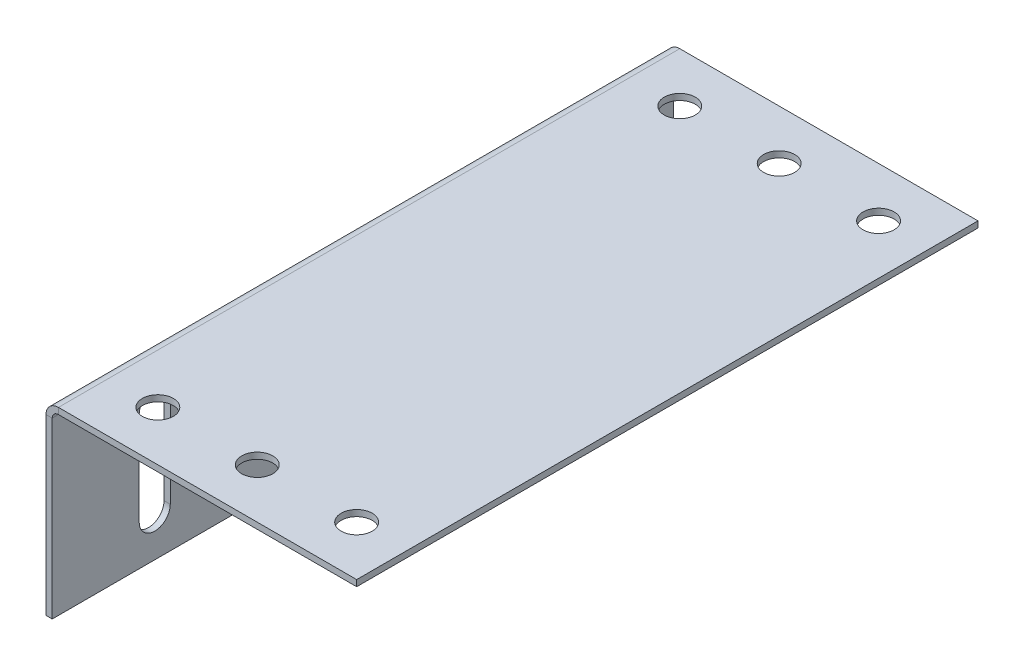
ISO-10303-21;
HEADER;
FILE_DESCRIPTION(('STEP AP214'),'2;1');
FILE_NAME('part.step','',(''),(''),'','','');
FILE_SCHEMA(('AUTOMOTIVE_DESIGN { 1 0 10303 214 1 1 1 1 }'));
ENDSEC;
DATA;
#1=APPLICATION_CONTEXT('core data for automotive mechanical design processes');
#2=APPLICATION_PROTOCOL_DEFINITION('international standard','automotive_design',2000,#1);
#3=PRODUCT_CONTEXT('',#1,'mechanical');
#4=PRODUCT('Part','Part','',(#3));
#5=PRODUCT_RELATED_PRODUCT_CATEGORY('part','',(#4));
#6=PRODUCT_DEFINITION_FORMATION('','',#4);
#7=PRODUCT_DEFINITION_CONTEXT('part definition',#1,'design');
#8=PRODUCT_DEFINITION('design','',#6,#7);
#9=PRODUCT_DEFINITION_SHAPE('','',#8);
#10=(LENGTH_UNIT() NAMED_UNIT(*) SI_UNIT(.MILLI.,.METRE.));
#11=(NAMED_UNIT(*) PLANE_ANGLE_UNIT() SI_UNIT($,.RADIAN.));
#12=(NAMED_UNIT(*) SI_UNIT($,.STERADIAN.) SOLID_ANGLE_UNIT());
#13=UNCERTAINTY_MEASURE_WITH_UNIT(LENGTH_MEASURE(1.E-05),#10,'distance_accuracy_value','');
#14=(GEOMETRIC_REPRESENTATION_CONTEXT(3) GLOBAL_UNCERTAINTY_ASSIGNED_CONTEXT((#13)) GLOBAL_UNIT_ASSIGNED_CONTEXT((#10,
#11,#12)) REPRESENTATION_CONTEXT('',''));
#15=CARTESIAN_POINT('',(0.,0.,0.));
#16=DIRECTION('',(0.,0.,1.));
#17=DIRECTION('',(1.,0.,0.));
#18=AXIS2_PLACEMENT_3D('',#15,#16,#17);
#19=CARTESIAN_POINT('',(0.,0.,100.));
#20=DIRECTION('',(-1.,0.,0.));
#21=DIRECTION('',(0.,0.,1.));
#22=AXIS2_PLACEMENT_3D('',#19,#20,#21);
#23=PLANE('',#22);
#24=DIRECTION('',(0.,1.,0.));
#25=VECTOR('',#24,1.);
#26=CARTESIAN_POINT('',(0.,0.,0.));
#27=LINE('',#26,#25);
#28=CARTESIAN_POINT('',(0.,0.,0.));
#29=VERTEX_POINT('',#28);
#30=CARTESIAN_POINT('',(0.,28.,0.));
#31=VERTEX_POINT('',#30);
#32=EDGE_CURVE('E404',#29,#31,#27,.T.);
#33=ORIENTED_EDGE('',*,*,#32,.F.);
#34=DIRECTION('',(0.,0.,-1.));
#35=VECTOR('',#34,1.);
#36=CARTESIAN_POINT('',(0.,0.,100.));
#37=LINE('',#36,#35);
#38=CARTESIAN_POINT('',(0.,0.,100.));
#39=VERTEX_POINT('',#38);
#40=EDGE_CURVE('E422',#39,#29,#37,.T.);
#41=ORIENTED_EDGE('',*,*,#40,.F.);
#42=DIRECTION('',(0.,1.,0.));
#43=VECTOR('',#42,1.);
#44=CARTESIAN_POINT('',(0.,0.,100.));
#45=LINE('',#44,#43);
#46=CARTESIAN_POINT('',(0.,28.,100.));
#47=VERTEX_POINT('',#46);
#48=EDGE_CURVE('E380',#39,#47,#45,.T.);
#49=ORIENTED_EDGE('',*,*,#48,.T.);
#50=DIRECTION('',(0.,0.,-1.));
#51=VECTOR('',#50,1.);
#52=CARTESIAN_POINT('',(0.,28.,100.));
#53=LINE('',#52,#51);
#54=EDGE_CURVE('E424',#47,#31,#53,.T.);
#55=ORIENTED_EDGE('',*,*,#54,.T.);
#56=EDGE_LOOP('',(#33,#41,#49,#55));
#57=FACE_BOUND('',#56,.T.);
#58=DIRECTION('',(0.,-1.,0.));
#59=VECTOR('',#58,1.);
#60=CARTESIAN_POINT('',(0.,0.,39.));
#61=LINE('',#60,#59);
#62=CARTESIAN_POINT('',(0.,21.4999999999999,39.));
#63=VERTEX_POINT('',#62);
#64=CARTESIAN_POINT('',(0.,6.49999999999986,39.));
#65=VERTEX_POINT('',#64);
#66=EDGE_CURVE('E281',#63,#65,#61,.T.);
#67=ORIENTED_EDGE('',*,*,#66,.T.);
#68=CARTESIAN_POINT('',(0.,6.49999999999986,36.5));
#69=DIRECTION('',(-1.,0.,0.));
#70=DIRECTION('',(0.,0.,1.));
#71=AXIS2_PLACEMENT_3D('',#68,#69,#70);
#72=CIRCLE('',#71,2.5);
#73=CARTESIAN_POINT('',(0.,6.49999999999986,34.));
#74=VERTEX_POINT('',#73);
#75=EDGE_CURVE('E278',#65,#74,#72,.F.);
#76=ORIENTED_EDGE('',*,*,#75,.T.);
#77=DIRECTION('',(0.,-1.,0.));
#78=VECTOR('',#77,1.);
#79=CARTESIAN_POINT('',(0.,0.,34.));
#80=LINE('',#79,#78);
#81=CARTESIAN_POINT('',(0.,21.4999999999999,34.));
#82=VERTEX_POINT('',#81);
#83=EDGE_CURVE('E287',#82,#74,#80,.T.);
#84=ORIENTED_EDGE('',*,*,#83,.F.);
#85=CARTESIAN_POINT('',(0.,21.4999999999999,36.5));
#86=DIRECTION('',(-1.,0.,0.));
#87=DIRECTION('',(0.,0.,1.));
#88=AXIS2_PLACEMENT_3D('',#85,#86,#87);
#89=CIRCLE('',#88,2.5);
#90=EDGE_CURVE('E284',#82,#63,#89,.F.);
#91=ORIENTED_EDGE('',*,*,#90,.T.);
#92=EDGE_LOOP('',(#67,#76,#84,#91));
#93=FACE_BOUND('',#92,.T.);
#94=CARTESIAN_POINT('',(0.,21.5,83.5));
#95=DIRECTION('',(-1.,0.,0.));
#96=DIRECTION('',(0.,0.,1.));
#97=AXIS2_PLACEMENT_3D('',#94,#95,#96);
#98=CIRCLE('',#97,2.5);
#99=CARTESIAN_POINT('',(0.,21.5,86.));
#100=VERTEX_POINT('',#99);
#101=CARTESIAN_POINT('',(0.,21.5,81.));
#102=VERTEX_POINT('',#101);
#103=EDGE_CURVE('E312',#100,#102,#98,.T.);
#104=ORIENTED_EDGE('',*,*,#103,.F.);
#105=DIRECTION('',(0.,-1.,0.));
#106=VECTOR('',#105,1.);
#107=CARTESIAN_POINT('',(0.,0.,86.));
#108=LINE('',#107,#106);
#109=CARTESIAN_POINT('',(0.,6.49999999999999,86.));
#110=VERTEX_POINT('',#109);
#111=EDGE_CURVE('E309',#100,#110,#108,.T.);
#112=ORIENTED_EDGE('',*,*,#111,.T.);
#113=CARTESIAN_POINT('',(0.,6.49999999999999,83.5));
#114=DIRECTION('',(-1.,0.,0.));
#115=DIRECTION('',(0.,0.,1.));
#116=AXIS2_PLACEMENT_3D('',#113,#114,#115);
#117=CIRCLE('',#116,2.5);
#118=CARTESIAN_POINT('',(0.,6.49999999999999,81.));
#119=VERTEX_POINT('',#118);
#120=EDGE_CURVE('E318',#119,#110,#117,.T.);
#121=ORIENTED_EDGE('',*,*,#120,.F.);
#122=DIRECTION('',(0.,-1.,0.));
#123=VECTOR('',#122,1.);
#124=CARTESIAN_POINT('',(0.,0.,81.));
#125=LINE('',#124,#123);
#126=EDGE_CURVE('E315',#102,#119,#125,.T.);
#127=ORIENTED_EDGE('',*,*,#126,.F.);
#128=EDGE_LOOP('',(#104,#112,#121,#127));
#129=FACE_BOUND('',#128,.T.);
#130=CARTESIAN_POINT('',(0.,21.4999999999999,63.5));
#131=DIRECTION('',(-1.,0.,0.));
#132=DIRECTION('',(0.,0.,1.));
#133=AXIS2_PLACEMENT_3D('',#130,#131,#132);
#134=CIRCLE('',#133,2.5);
#135=CARTESIAN_POINT('',(0.,21.4999999999999,66.));
#136=VERTEX_POINT('',#135);
#137=CARTESIAN_POINT('',(0.,21.4999999999998,61.));
#138=VERTEX_POINT('',#137);
#139=EDGE_CURVE('E248',#136,#138,#134,.T.);
#140=ORIENTED_EDGE('',*,*,#139,.F.);
#141=DIRECTION('',(0.,-1.,0.));
#142=VECTOR('',#141,1.);
#143=CARTESIAN_POINT('',(0.,0.,66.));
#144=LINE('',#143,#142);
#145=CARTESIAN_POINT('',(0.,6.49999999999985,66.));
#146=VERTEX_POINT('',#145);
#147=EDGE_CURVE('E63',#136,#146,#144,.T.);
#148=ORIENTED_EDGE('',*,*,#147,.T.);
#149=CARTESIAN_POINT('',(0.,6.49999999999985,63.5));
#150=DIRECTION('',(-1.,0.,0.));
#151=DIRECTION('',(0.,0.,1.));
#152=AXIS2_PLACEMENT_3D('',#149,#150,#151);
#153=CIRCLE('',#152,2.5);
#154=CARTESIAN_POINT('',(0.,6.49999999999985,61.));
#155=VERTEX_POINT('',#154);
#156=EDGE_CURVE('E254',#155,#146,#153,.T.);
#157=ORIENTED_EDGE('',*,*,#156,.F.);
#158=DIRECTION('',(0.,-1.,0.));
#159=VECTOR('',#158,1.);
#160=CARTESIAN_POINT('',(0.,0.,61.));
#161=LINE('',#160,#159);
#162=EDGE_CURVE('E251',#138,#155,#161,.T.);
#163=ORIENTED_EDGE('',*,*,#162,.F.);
#164=EDGE_LOOP('',(#140,#148,#157,#163));
#165=FACE_BOUND('',#164,.T.);
#166=DIRECTION('',(0.,-1.,0.));
#167=VECTOR('',#166,1.);
#168=CARTESIAN_POINT('',(0.,0.,14.));
#169=LINE('',#168,#167);
#170=CARTESIAN_POINT('',(0.,21.5,14.));
#171=VERTEX_POINT('',#170);
#172=CARTESIAN_POINT('',(0.,6.5,14.));
#173=VERTEX_POINT('',#172);
#174=EDGE_CURVE('E223',#171,#173,#169,.T.);
#175=ORIENTED_EDGE('',*,*,#174,.F.);
#176=CARTESIAN_POINT('',(0.,21.5,16.5));
#177=DIRECTION('',(-1.,0.,0.));
#178=DIRECTION('',(0.,0.,1.));
#179=AXIS2_PLACEMENT_3D('',#176,#177,#178);
#180=CIRCLE('',#179,2.5);
#181=CARTESIAN_POINT('',(0.,21.5,19.));
#182=VERTEX_POINT('',#181);
#183=EDGE_CURVE('E55',#171,#182,#180,.F.);
#184=ORIENTED_EDGE('',*,*,#183,.T.);
#185=DIRECTION('',(0.,-1.,0.));
#186=VECTOR('',#185,1.);
#187=CARTESIAN_POINT('',(0.,0.,19.));
#188=LINE('',#187,#186);
#189=CARTESIAN_POINT('',(0.,6.5,19.));
#190=VERTEX_POINT('',#189);
#191=EDGE_CURVE('E208',#182,#190,#188,.T.);
#192=ORIENTED_EDGE('',*,*,#191,.T.);
#193=CARTESIAN_POINT('',(0.,6.5,16.5));
#194=DIRECTION('',(-1.,0.,0.));
#195=DIRECTION('',(0.,0.,1.));
#196=AXIS2_PLACEMENT_3D('',#193,#194,#195);
#197=CIRCLE('',#196,2.5);
#198=EDGE_CURVE('E230',#190,#173,#197,.F.);
#199=ORIENTED_EDGE('',*,*,#198,.T.);
#200=EDGE_LOOP('',(#175,#184,#192,#199));
#201=FACE_BOUND('',#200,.T.);
#202=ADVANCED_FACE('F40',(#57,#93,#129,#165,#201),#23,.T.);
#203=CARTESIAN_POINT('',(1.,0.,100.));
#204=DIRECTION('',(-1.,0.,0.));
#205=DIRECTION('',(0.,0.,1.));
#206=AXIS2_PLACEMENT_3D('',#203,#204,#205);
#207=PLANE('',#206);
#208=DIRECTION('',(0.,1.,0.));
#209=VECTOR('',#208,1.);
#210=CARTESIAN_POINT('',(1.,0.,66.));
#211=LINE('',#210,#209);
#212=CARTESIAN_POINT('',(1.,6.49999999999985,66.));
#213=VERTEX_POINT('',#212);
#214=CARTESIAN_POINT('',(1.,21.4999999999999,66.));
#215=VERTEX_POINT('',#214);
#216=EDGE_CURVE('E244',#213,#215,#211,.T.);
#217=ORIENTED_EDGE('',*,*,#216,.T.);
#218=CARTESIAN_POINT('',(1.,21.4999999999999,63.5));
#219=DIRECTION('',(-1.,0.,0.));
#220=DIRECTION('',(0.,0.,1.));
#221=AXIS2_PLACEMENT_3D('',#218,#219,#220);
#222=CIRCLE('',#221,2.5);
#223=CARTESIAN_POINT('',(1.,21.4999999999998,61.));
#224=VERTEX_POINT('',#223);
#225=EDGE_CURVE('E260',#224,#215,#222,.F.);
#226=ORIENTED_EDGE('',*,*,#225,.F.);
#227=DIRECTION('',(0.,1.,0.));
#228=VECTOR('',#227,1.);
#229=CARTESIAN_POINT('',(1.,0.,61.));
#230=LINE('',#229,#228);
#231=CARTESIAN_POINT('',(1.,6.49999999999985,61.));
#232=VERTEX_POINT('',#231);
#233=EDGE_CURVE('E239',#232,#224,#230,.T.);
#234=ORIENTED_EDGE('',*,*,#233,.F.);
#235=CARTESIAN_POINT('',(1.,6.49999999999985,63.5));
#236=DIRECTION('',(-1.,0.,0.));
#237=DIRECTION('',(0.,0.,1.));
#238=AXIS2_PLACEMENT_3D('',#235,#236,#237);
#239=CIRCLE('',#238,2.5);
#240=EDGE_CURVE('E241',#213,#232,#239,.F.);
#241=ORIENTED_EDGE('',*,*,#240,.F.);
#242=EDGE_LOOP('',(#217,#226,#234,#241));
#243=FACE_BOUND('',#242,.T.);
#244=CARTESIAN_POINT('',(1.,6.49999999999986,36.5));
#245=DIRECTION('',(-1.,0.,0.));
#246=DIRECTION('',(0.,0.,1.));
#247=AXIS2_PLACEMENT_3D('',#244,#245,#246);
#248=CIRCLE('',#247,2.5);
#249=CARTESIAN_POINT('',(1.,6.49999999999986,34.));
#250=VERTEX_POINT('',#249);
#251=CARTESIAN_POINT('',(1.,6.49999999999986,39.));
#252=VERTEX_POINT('',#251);
#253=EDGE_CURVE('E275',#250,#252,#248,.T.);
#254=ORIENTED_EDGE('',*,*,#253,.T.);
#255=DIRECTION('',(0.,1.,0.));
#256=VECTOR('',#255,1.);
#257=CARTESIAN_POINT('',(1.,0.,39.));
#258=LINE('',#257,#256);
#259=CARTESIAN_POINT('',(1.,21.4999999999999,39.));
#260=VERTEX_POINT('',#259);
#261=EDGE_CURVE('E293',#252,#260,#258,.T.);
#262=ORIENTED_EDGE('',*,*,#261,.T.);
#263=CARTESIAN_POINT('',(1.,21.4999999999999,36.5));
#264=DIRECTION('',(-1.,0.,0.));
#265=DIRECTION('',(0.,0.,1.));
#266=AXIS2_PLACEMENT_3D('',#263,#264,#265);
#267=CIRCLE('',#266,2.5);
#268=CARTESIAN_POINT('',(1.,21.4999999999999,34.));
#269=VERTEX_POINT('',#268);
#270=EDGE_CURVE('E269',#260,#269,#267,.T.);
#271=ORIENTED_EDGE('',*,*,#270,.T.);
#272=DIRECTION('',(0.,1.,0.));
#273=VECTOR('',#272,1.);
#274=CARTESIAN_POINT('',(1.,0.,34.));
#275=LINE('',#274,#273);
#276=EDGE_CURVE('E272',#250,#269,#275,.T.);
#277=ORIENTED_EDGE('',*,*,#276,.F.);
#278=EDGE_LOOP('',(#254,#262,#271,#277));
#279=FACE_BOUND('',#278,.T.);
#280=DIRECTION('',(0.,1.,0.));
#281=VECTOR('',#280,1.);
#282=CARTESIAN_POINT('',(1.,0.,0.));
#283=LINE('',#282,#281);
#284=CARTESIAN_POINT('',(1.,0.,0.));
#285=VERTEX_POINT('',#284);
#286=CARTESIAN_POINT('',(1.,28.,0.));
#287=VERTEX_POINT('',#286);
#288=EDGE_CURVE('E410',#285,#287,#283,.T.);
#289=ORIENTED_EDGE('',*,*,#288,.T.);
#290=DIRECTION('',(0.,0.,-1.));
#291=VECTOR('',#290,1.);
#292=CARTESIAN_POINT('',(1.,28.,100.));
#293=LINE('',#292,#291);
#294=CARTESIAN_POINT('',(1.,28.,100.));
#295=VERTEX_POINT('',#294);
#296=EDGE_CURVE('E417',#295,#287,#293,.T.);
#297=ORIENTED_EDGE('',*,*,#296,.F.);
#298=DIRECTION('',(0.,1.,0.));
#299=VECTOR('',#298,1.);
#300=CARTESIAN_POINT('',(1.,0.,100.));
#301=LINE('',#300,#299);
#302=CARTESIAN_POINT('',(1.,0.,100.));
#303=VERTEX_POINT('',#302);
#304=EDGE_CURVE('E386',#303,#295,#301,.T.);
#305=ORIENTED_EDGE('',*,*,#304,.F.);
#306=DIRECTION('',(0.,0.,-1.));
#307=VECTOR('',#306,1.);
#308=CARTESIAN_POINT('',(1.,0.,100.));
#309=LINE('',#308,#307);
#310=EDGE_CURVE('E420',#303,#285,#309,.T.);
#311=ORIENTED_EDGE('',*,*,#310,.T.);
#312=EDGE_LOOP('',(#289,#297,#305,#311));
#313=FACE_BOUND('',#312,.T.);
#314=DIRECTION('',(0.,1.,0.));
#315=VECTOR('',#314,1.);
#316=CARTESIAN_POINT('',(1.,0.,86.));
#317=LINE('',#316,#315);
#318=CARTESIAN_POINT('',(1.,6.49999999999999,86.));
#319=VERTEX_POINT('',#318);
#320=CARTESIAN_POINT('',(1.,21.5,86.));
#321=VERTEX_POINT('',#320);
#322=EDGE_CURVE('E306',#319,#321,#317,.T.);
#323=ORIENTED_EDGE('',*,*,#322,.T.);
#324=CARTESIAN_POINT('',(1.,21.5,83.5));
#325=DIRECTION('',(-1.,0.,0.));
#326=DIRECTION('',(0.,0.,1.));
#327=AXIS2_PLACEMENT_3D('',#324,#325,#326);
#328=CIRCLE('',#327,2.5);
#329=CARTESIAN_POINT('',(1.,21.5,81.));
#330=VERTEX_POINT('',#329);
#331=EDGE_CURVE('E273',#330,#321,#328,.F.);
#332=ORIENTED_EDGE('',*,*,#331,.F.);
#333=DIRECTION('',(0.,1.,0.));
#334=VECTOR('',#333,1.);
#335=CARTESIAN_POINT('',(1.,0.,81.));
#336=LINE('',#335,#334);
#337=CARTESIAN_POINT('',(1.,6.49999999999999,81.));
#338=VERTEX_POINT('',#337);
#339=EDGE_CURVE('E268',#338,#330,#336,.T.);
#340=ORIENTED_EDGE('',*,*,#339,.F.);
#341=CARTESIAN_POINT('',(1.,6.49999999999999,83.5));
#342=DIRECTION('',(-1.,0.,0.));
#343=DIRECTION('',(0.,0.,1.));
#344=AXIS2_PLACEMENT_3D('',#341,#342,#343);
#345=CIRCLE('',#344,2.5);
#346=EDGE_CURVE('E303',#319,#338,#345,.F.);
#347=ORIENTED_EDGE('',*,*,#346,.F.);
#348=EDGE_LOOP('',(#323,#332,#340,#347));
#349=FACE_BOUND('',#348,.T.);
#350=CARTESIAN_POINT('',(1.,21.5,16.5));
#351=DIRECTION('',(-1.,0.,0.));
#352=DIRECTION('',(0.,0.,1.));
#353=AXIS2_PLACEMENT_3D('',#350,#351,#352);
#354=CIRCLE('',#353,2.5);
#355=CARTESIAN_POINT('',(1.,21.5,19.));
#356=VERTEX_POINT('',#355);
#357=CARTESIAN_POINT('',(1.,21.5,14.));
#358=VERTEX_POINT('',#357);
#359=EDGE_CURVE('E202',#356,#358,#354,.T.);
#360=ORIENTED_EDGE('',*,*,#359,.T.);
#361=DIRECTION('',(0.,1.,0.));
#362=VECTOR('',#361,1.);
#363=CARTESIAN_POINT('',(1.,0.,14.));
#364=LINE('',#363,#362);
#365=CARTESIAN_POINT('',(1.,6.5,14.));
#366=VERTEX_POINT('',#365);
#367=EDGE_CURVE('E212',#366,#358,#364,.T.);
#368=ORIENTED_EDGE('',*,*,#367,.F.);
#369=CARTESIAN_POINT('',(1.,6.5,16.5));
#370=DIRECTION('',(-1.,0.,0.));
#371=DIRECTION('',(0.,0.,1.));
#372=AXIS2_PLACEMENT_3D('',#369,#370,#371);
#373=CIRCLE('',#372,2.5);
#374=CARTESIAN_POINT('',(1.,6.5,19.));
#375=VERTEX_POINT('',#374);
#376=EDGE_CURVE('E225',#366,#375,#373,.T.);
#377=ORIENTED_EDGE('',*,*,#376,.T.);
#378=DIRECTION('',(0.,1.,0.));
#379=VECTOR('',#378,1.);
#380=CARTESIAN_POINT('',(1.,0.,19.));
#381=LINE('',#380,#379);
#382=EDGE_CURVE('E221',#375,#356,#381,.T.);
#383=ORIENTED_EDGE('',*,*,#382,.T.);
#384=EDGE_LOOP('',(#360,#368,#377,#383));
#385=FACE_BOUND('',#384,.T.);
#386=ADVANCED_FACE('F219',(#243,#279,#313,#349,#385),#207,.F.);
#387=CARTESIAN_POINT('',(2.,30.,100.));
#388=DIRECTION('',(0.,0.,1.));
#389=DIRECTION('',(1.,0.,0.));
#390=AXIS2_PLACEMENT_3D('',#387,#388,#389);
#391=PLANE('',#390);
#392=DIRECTION('',(0.,-1.,0.));
#393=VECTOR('',#392,1.);
#394=CARTESIAN_POINT('',(2.,30.,100.));
#395=LINE('',#394,#393);
#396=CARTESIAN_POINT('',(2.,30.,100.));
#397=VERTEX_POINT('',#396);
#398=CARTESIAN_POINT('',(2.,29.,100.));
#399=VERTEX_POINT('',#398);
#400=EDGE_CURVE('E11',#397,#399,#395,.T.);
#401=ORIENTED_EDGE('',*,*,#400,.F.);
#402=CARTESIAN_POINT('',(2.,28.,100.));
#403=DIRECTION('',(0.,0.,1.));
#404=DIRECTION('',(1.,0.,0.));
#405=AXIS2_PLACEMENT_3D('',#402,#403,#404);
#406=CIRCLE('',#405,2.);
#407=EDGE_CURVE('E377',#47,#397,#406,.F.);
#408=ORIENTED_EDGE('',*,*,#407,.F.);
#409=DIRECTION('',(-1.,0.,0.));
#410=VECTOR('',#409,1.);
#411=CARTESIAN_POINT('',(1.,28.,100.));
#412=LINE('',#411,#410);
#413=EDGE_CURVE('E48',#295,#47,#412,.T.);
#414=ORIENTED_EDGE('',*,*,#413,.F.);
#415=CARTESIAN_POINT('',(2.,28.,100.));
#416=DIRECTION('',(0.,0.,1.));
#417=DIRECTION('',(1.,0.,0.));
#418=AXIS2_PLACEMENT_3D('',#415,#416,#417);
#419=CIRCLE('',#418,1.);
#420=EDGE_CURVE('E389',#295,#399,#419,.F.);
#421=ORIENTED_EDGE('',*,*,#420,.T.);
#422=EDGE_LOOP('',(#401,#408,#414,#421));
#423=FACE_BOUND('',#422,.T.);
#424=ADVANCED_FACE('F42',(#423),#391,.T.);
#425=CARTESIAN_POINT('',(1.,28.,100.));
#426=DIRECTION('',(0.,0.,1.));
#427=DIRECTION('',(1.,0.,0.));
#428=AXIS2_PLACEMENT_3D('',#425,#426,#427);
#429=PLANE('',#428);
#430=DIRECTION('',(1.,0.,0.));
#431=VECTOR('',#430,1.);
#432=CARTESIAN_POINT('',(0.,30.,100.));
#433=LINE('',#432,#431);
#434=CARTESIAN_POINT('',(50.,30.,100.));
#435=VERTEX_POINT('',#434);
#436=EDGE_CURVE('E374',#397,#435,#433,.T.);
#437=ORIENTED_EDGE('',*,*,#436,.F.);
#438=ORIENTED_EDGE('',*,*,#400,.T.);
#439=DIRECTION('',(1.,0.,0.));
#440=VECTOR('',#439,1.);
#441=CARTESIAN_POINT('',(0.,29.,100.));
#442=LINE('',#441,#440);
#443=CARTESIAN_POINT('',(50.,29.,100.));
#444=VERTEX_POINT('',#443);
#445=EDGE_CURVE('E368',#399,#444,#442,.T.);
#446=ORIENTED_EDGE('',*,*,#445,.T.);
#447=DIRECTION('',(0.,-1.,0.));
#448=VECTOR('',#447,1.);
#449=CARTESIAN_POINT('',(50.,30.,100.));
#450=LINE('',#449,#448);
#451=EDGE_CURVE('E370',#435,#444,#450,.T.);
#452=ORIENTED_EDGE('',*,*,#451,.F.);
#453=EDGE_LOOP('',(#437,#438,#446,#452));
#454=FACE_BOUND('',#453,.T.);
#455=ADVANCED_FACE('F472',(#454),#429,.T.);
#456=CARTESIAN_POINT('',(0.,28.,0.));
#457=DIRECTION('',(0.,0.,-1.));
#458=DIRECTION('',(-1.,0.,0.));
#459=AXIS2_PLACEMENT_3D('',#456,#457,#458);
#460=PLANE('',#459);
#461=DIRECTION('',(1.,0.,0.));
#462=VECTOR('',#461,1.);
#463=CARTESIAN_POINT('',(0.,28.,0.));
#464=LINE('',#463,#462);
#465=EDGE_CURVE('E436',#31,#287,#464,.T.);
#466=ORIENTED_EDGE('',*,*,#465,.F.);
#467=CARTESIAN_POINT('',(2.,28.,0.));
#468=DIRECTION('',(0.,0.,1.));
#469=DIRECTION('',(1.,0.,0.));
#470=AXIS2_PLACEMENT_3D('',#467,#468,#469);
#471=CIRCLE('',#470,2.);
#472=CARTESIAN_POINT('',(2.,30.,0.));
#473=VERTEX_POINT('',#472);
#474=EDGE_CURVE('E401',#31,#473,#471,.F.);
#475=ORIENTED_EDGE('',*,*,#474,.T.);
#476=DIRECTION('',(0.,1.,0.));
#477=VECTOR('',#476,1.);
#478=CARTESIAN_POINT('',(2.,29.,0.));
#479=LINE('',#478,#477);
#480=CARTESIAN_POINT('',(2.,29.,0.));
#481=VERTEX_POINT('',#480);
#482=EDGE_CURVE('E434',#481,#473,#479,.T.);
#483=ORIENTED_EDGE('',*,*,#482,.F.);
#484=CARTESIAN_POINT('',(2.,28.,0.));
#485=DIRECTION('',(0.,0.,1.));
#486=DIRECTION('',(1.,0.,0.));
#487=AXIS2_PLACEMENT_3D('',#484,#485,#486);
#488=CIRCLE('',#487,1.);
#489=EDGE_CURVE('E371',#287,#481,#488,.F.);
#490=ORIENTED_EDGE('',*,*,#489,.F.);
#491=EDGE_LOOP('',(#466,#475,#483,#490));
#492=FACE_BOUND('',#491,.T.);
#493=ADVANCED_FACE('F479',(#492),#460,.T.);
#494=CARTESIAN_POINT('',(2.,29.,0.));
#495=DIRECTION('',(0.,0.,-1.));
#496=DIRECTION('',(-1.,0.,0.));
#497=AXIS2_PLACEMENT_3D('',#494,#495,#496);
#498=PLANE('',#497);
#499=ORIENTED_EDGE('',*,*,#32,.T.);
#500=ORIENTED_EDGE('',*,*,#465,.T.);
#501=ORIENTED_EDGE('',*,*,#288,.F.);
#502=DIRECTION('',(-1.,0.,0.));
#503=VECTOR('',#502,1.);
#504=CARTESIAN_POINT('',(1.,0.,0.));
#505=LINE('',#504,#503);
#506=EDGE_CURVE('E407',#285,#29,#505,.T.);
#507=ORIENTED_EDGE('',*,*,#506,.T.);
#508=EDGE_LOOP('',(#499,#500,#501,#507));
#509=FACE_BOUND('',#508,.T.);
#510=ADVANCED_FACE('F481',(#509),#498,.T.);
#511=CARTESIAN_POINT('',(0.,29.,100.));
#512=DIRECTION('',(0.,1.,0.));
#513=DIRECTION('',(0.,0.,1.));
#514=AXIS2_PLACEMENT_3D('',#511,#512,#513);
#515=PLANE('',#514);
#516=CARTESIAN_POINT('',(26.,29.,8.));
#517=DIRECTION('',(0.,1.,0.));
#518=DIRECTION('',(0.,0.,1.));
#519=AXIS2_PLACEMENT_3D('',#516,#517,#518);
#520=CIRCLE('',#519,2.5);
#521=CARTESIAN_POINT('',(26.,29.,10.5));
#522=VERTEX_POINT('',#521);
#523=EDGE_CURVE('E342',#522,#522,#520,.F.);
#524=ORIENTED_EDGE('',*,*,#523,.F.);
#525=EDGE_LOOP('',(#524));
#526=FACE_BOUND('',#525,.T.);
#527=CARTESIAN_POINT('',(10.,29.,92.));
#528=DIRECTION('',(0.,1.,0.));
#529=DIRECTION('',(0.,0.,1.));
#530=AXIS2_PLACEMENT_3D('',#527,#528,#529);
#531=CIRCLE('',#530,2.5);
#532=CARTESIAN_POINT('',(10.,29.,94.5));
#533=VERTEX_POINT('',#532);
#534=EDGE_CURVE('E341',#533,#533,#531,.F.);
#535=ORIENTED_EDGE('',*,*,#534,.F.);
#536=EDGE_LOOP('',(#535));
#537=FACE_BOUND('',#536,.T.);
#538=CARTESIAN_POINT('',(42.,29.,92.));
#539=DIRECTION('',(0.,1.,0.));
#540=DIRECTION('',(0.,0.,1.));
#541=AXIS2_PLACEMENT_3D('',#538,#539,#540);
#542=CIRCLE('',#541,2.5);
#543=CARTESIAN_POINT('',(42.,29.,94.5));
#544=VERTEX_POINT('',#543);
#545=EDGE_CURVE('E354',#544,#544,#542,.F.);
#546=ORIENTED_EDGE('',*,*,#545,.F.);
#547=EDGE_LOOP('',(#546));
#548=FACE_BOUND('',#547,.T.);
#549=CARTESIAN_POINT('',(10.,29.,8.00000000000001));
#550=DIRECTION('',(0.,1.,0.));
#551=DIRECTION('',(0.,0.,1.));
#552=AXIS2_PLACEMENT_3D('',#549,#550,#551);
#553=CIRCLE('',#552,2.5);
#554=CARTESIAN_POINT('',(10.,29.,10.5));
#555=VERTEX_POINT('',#554);
#556=EDGE_CURVE('E353',#555,#555,#553,.F.);
#557=ORIENTED_EDGE('',*,*,#556,.F.);
#558=EDGE_LOOP('',(#557));
#559=FACE_BOUND('',#558,.T.);
#560=CARTESIAN_POINT('',(26.,29.,92.));
#561=DIRECTION('',(0.,1.,0.));
#562=DIRECTION('',(0.,0.,1.));
#563=AXIS2_PLACEMENT_3D('',#560,#561,#562);
#564=CIRCLE('',#563,2.49999999999999);
#565=CARTESIAN_POINT('',(26.,29.,94.5));
#566=VERTEX_POINT('',#565);
#567=EDGE_CURVE('E334',#566,#566,#564,.F.);
#568=ORIENTED_EDGE('',*,*,#567,.F.);
#569=EDGE_LOOP('',(#568));
#570=FACE_BOUND('',#569,.T.);
#571=CARTESIAN_POINT('',(42.,29.,8.));
#572=DIRECTION('',(0.,1.,0.));
#573=DIRECTION('',(0.,0.,1.));
#574=AXIS2_PLACEMENT_3D('',#571,#572,#573);
#575=CIRCLE('',#574,2.5);
#576=CARTESIAN_POINT('',(42.,29.,10.5));
#577=VERTEX_POINT('',#576);
#578=EDGE_CURVE('E364',#577,#577,#575,.F.);
#579=ORIENTED_EDGE('',*,*,#578,.F.);
#580=EDGE_LOOP('',(#579));
#581=FACE_BOUND('',#580,.T.);
#582=DIRECTION('',(1.,0.,0.));
#583=VECTOR('',#582,1.);
#584=CARTESIAN_POINT('',(0.,29.,0.));
#585=LINE('',#584,#583);
#586=CARTESIAN_POINT('',(50.,29.,0.));
#587=VERTEX_POINT('',#586);
#588=EDGE_CURVE('E367',#481,#587,#585,.T.);
#589=ORIENTED_EDGE('',*,*,#588,.T.);
#590=DIRECTION('',(0.,0.,-1.));
#591=VECTOR('',#590,1.);
#592=CARTESIAN_POINT('',(50.,29.,100.));
#593=LINE('',#592,#591);
#594=EDGE_CURVE('E432',#444,#587,#593,.T.);
#595=ORIENTED_EDGE('',*,*,#594,.F.);
#596=ORIENTED_EDGE('',*,*,#445,.F.);
#597=DIRECTION('',(0.,0.,-1.));
#598=VECTOR('',#597,1.);
#599=CARTESIAN_POINT('',(2.,29.,100.));
#600=LINE('',#599,#598);
#601=EDGE_CURVE('E392',#399,#481,#600,.T.);
#602=ORIENTED_EDGE('',*,*,#601,.T.);
#603=EDGE_LOOP('',(#589,#595,#596,#602));
#604=FACE_BOUND('',#603,.T.);
#605=ADVANCED_FACE('F468',(#526,#537,#548,#559,#570,#581,#604),#515,.F.);
#606=CARTESIAN_POINT('',(50.,30.,100.));
#607=DIRECTION('',(1.,0.,0.));
#608=DIRECTION('',(0.,0.,-1.));
#609=AXIS2_PLACEMENT_3D('',#606,#607,#608);
#610=PLANE('',#609);
#611=DIRECTION('',(0.,-1.,0.));
#612=VECTOR('',#611,1.);
#613=CARTESIAN_POINT('',(50.,30.,0.));
#614=LINE('',#613,#612);
#615=CARTESIAN_POINT('',(50.,30.,0.));
#616=VERTEX_POINT('',#615);
#617=EDGE_CURVE('E395',#616,#587,#614,.T.);
#618=ORIENTED_EDGE('',*,*,#617,.F.);
#619=DIRECTION('',(0.,0.,-1.));
#620=VECTOR('',#619,1.);
#621=CARTESIAN_POINT('',(50.,30.,100.));
#622=LINE('',#621,#620);
#623=EDGE_CURVE('E430',#435,#616,#622,.T.);
#624=ORIENTED_EDGE('',*,*,#623,.F.);
#625=ORIENTED_EDGE('',*,*,#451,.T.);
#626=ORIENTED_EDGE('',*,*,#594,.T.);
#627=EDGE_LOOP('',(#618,#624,#625,#626));
#628=FACE_BOUND('',#627,.T.);
#629=ADVANCED_FACE('F488',(#628),#610,.T.);
#630=CARTESIAN_POINT('',(0.,30.,100.));
#631=DIRECTION('',(0.,1.,0.));
#632=DIRECTION('',(0.,0.,1.));
#633=AXIS2_PLACEMENT_3D('',#630,#631,#632);
#634=PLANE('',#633);
#635=CARTESIAN_POINT('',(26.,30.,8.));
#636=DIRECTION('',(0.,1.,0.));
#637=DIRECTION('',(0.,0.,1.));
#638=AXIS2_PLACEMENT_3D('',#635,#636,#637);
#639=CIRCLE('',#638,2.5);
#640=CARTESIAN_POINT('',(26.,30.,10.5));
#641=VERTEX_POINT('',#640);
#642=EDGE_CURVE('E337',#641,#641,#639,.T.);
#643=ORIENTED_EDGE('',*,*,#642,.F.);
#644=EDGE_LOOP('',(#643));
#645=FACE_BOUND('',#644,.T.);
#646=CARTESIAN_POINT('',(10.,30.,92.));
#647=DIRECTION('',(0.,1.,0.));
#648=DIRECTION('',(0.,0.,1.));
#649=AXIS2_PLACEMENT_3D('',#646,#647,#648);
#650=CIRCLE('',#649,2.5);
#651=CARTESIAN_POINT('',(10.,30.,94.5));
#652=VERTEX_POINT('',#651);
#653=EDGE_CURVE('E338',#652,#652,#650,.T.);
#654=ORIENTED_EDGE('',*,*,#653,.F.);
#655=EDGE_LOOP('',(#654));
#656=FACE_BOUND('',#655,.T.);
#657=CARTESIAN_POINT('',(42.,30.,92.));
#658=DIRECTION('',(0.,1.,0.));
#659=DIRECTION('',(0.,0.,-1.));
#660=AXIS2_PLACEMENT_3D('',#657,#658,#659);
#661=CIRCLE('',#660,2.5);
#662=CARTESIAN_POINT('',(42.,30.,89.5));
#663=VERTEX_POINT('',#662);
#664=EDGE_CURVE('E345',#663,#663,#661,.T.);
#665=ORIENTED_EDGE('',*,*,#664,.F.);
#666=EDGE_LOOP('',(#665));
#667=FACE_BOUND('',#666,.T.);
#668=CARTESIAN_POINT('',(10.,30.,8.00000000000001));
#669=DIRECTION('',(0.,1.,0.));
#670=DIRECTION('',(0.,0.,-1.));
#671=AXIS2_PLACEMENT_3D('',#668,#669,#670);
#672=CIRCLE('',#671,2.5);
#673=CARTESIAN_POINT('',(10.,30.,5.50000000000001));
#674=VERTEX_POINT('',#673);
#675=EDGE_CURVE('E350',#674,#674,#672,.T.);
#676=ORIENTED_EDGE('',*,*,#675,.F.);
#677=EDGE_LOOP('',(#676));
#678=FACE_BOUND('',#677,.T.);
#679=CARTESIAN_POINT('',(26.,30.,92.));
#680=DIRECTION('',(0.,1.,0.));
#681=DIRECTION('',(0.,0.,-1.));
#682=AXIS2_PLACEMENT_3D('',#679,#680,#681);
#683=CIRCLE('',#682,2.49999999999999);
#684=CARTESIAN_POINT('',(26.,30.,89.5));
#685=VERTEX_POINT('',#684);
#686=EDGE_CURVE('E216',#685,#685,#683,.T.);
#687=ORIENTED_EDGE('',*,*,#686,.F.);
#688=EDGE_LOOP('',(#687));
#689=FACE_BOUND('',#688,.T.);
#690=CARTESIAN_POINT('',(42.,30.,8.));
#691=DIRECTION('',(0.,1.,0.));
#692=DIRECTION('',(0.,0.,1.));
#693=AXIS2_PLACEMENT_3D('',#690,#691,#692);
#694=CIRCLE('',#693,2.5);
#695=CARTESIAN_POINT('',(42.,30.,10.5));
#696=VERTEX_POINT('',#695);
#697=EDGE_CURVE('E357',#696,#696,#694,.T.);
#698=ORIENTED_EDGE('',*,*,#697,.F.);
#699=EDGE_LOOP('',(#698));
#700=FACE_BOUND('',#699,.T.);
#701=DIRECTION('',(1.,0.,0.));
#702=VECTOR('',#701,1.);
#703=CARTESIAN_POINT('',(0.,30.,0.));
#704=LINE('',#703,#702);
#705=EDGE_CURVE('E398',#473,#616,#704,.T.);
#706=ORIENTED_EDGE('',*,*,#705,.F.);
#707=DIRECTION('',(0.,0.,-1.));
#708=VECTOR('',#707,1.);
#709=CARTESIAN_POINT('',(2.,30.,100.));
#710=LINE('',#709,#708);
#711=EDGE_CURVE('E427',#397,#473,#710,.T.);
#712=ORIENTED_EDGE('',*,*,#711,.F.);
#713=ORIENTED_EDGE('',*,*,#436,.T.);
#714=ORIENTED_EDGE('',*,*,#623,.T.);
#715=EDGE_LOOP('',(#706,#712,#713,#714));
#716=FACE_BOUND('',#715,.T.);
#717=ADVANCED_FACE('F475',(#645,#656,#667,#678,#689,#700,#716),#634,.T.);
#718=CARTESIAN_POINT('',(2.,28.,100.));
#719=DIRECTION('',(0.,0.,-1.));
#720=DIRECTION('',(-1.,0.,0.));
#721=AXIS2_PLACEMENT_3D('',#718,#719,#720);
#722=CYLINDRICAL_SURFACE('',#721,2.);
#723=ORIENTED_EDGE('',*,*,#474,.F.);
#724=ORIENTED_EDGE('',*,*,#54,.F.);
#725=ORIENTED_EDGE('',*,*,#407,.T.);
#726=ORIENTED_EDGE('',*,*,#711,.T.);
#727=EDGE_LOOP('',(#723,#724,#725,#726));
#728=FACE_BOUND('',#727,.T.);
#729=ADVANCED_FACE('F448',(#728),#722,.T.);
#730=CARTESIAN_POINT('',(1.,0.,100.));
#731=DIRECTION('',(0.,-1.,0.));
#732=DIRECTION('',(0.,0.,-1.));
#733=AXIS2_PLACEMENT_3D('',#730,#731,#732);
#734=PLANE('',#733);
#735=ORIENTED_EDGE('',*,*,#506,.F.);
#736=ORIENTED_EDGE('',*,*,#310,.F.);
#737=DIRECTION('',(-1.,0.,0.));
#738=VECTOR('',#737,1.);
#739=CARTESIAN_POINT('',(1.,0.,100.));
#740=LINE('',#739,#738);
#741=EDGE_CURVE('E383',#303,#39,#740,.T.);
#742=ORIENTED_EDGE('',*,*,#741,.T.);
#743=ORIENTED_EDGE('',*,*,#40,.T.);
#744=EDGE_LOOP('',(#735,#736,#742,#743));
#745=FACE_BOUND('',#744,.T.);
#746=ADVANCED_FACE('F455',(#745),#734,.T.);
#747=CARTESIAN_POINT('',(2.,28.,100.));
#748=DIRECTION('',(0.,0.,-1.));
#749=DIRECTION('',(-1.,0.,0.));
#750=AXIS2_PLACEMENT_3D('',#747,#748,#749);
#751=CYLINDRICAL_SURFACE('',#750,1.);
#752=ORIENTED_EDGE('',*,*,#489,.T.);
#753=ORIENTED_EDGE('',*,*,#601,.F.);
#754=ORIENTED_EDGE('',*,*,#420,.F.);
#755=ORIENTED_EDGE('',*,*,#296,.T.);
#756=EDGE_LOOP('',(#752,#753,#754,#755));
#757=FACE_BOUND('',#756,.T.);
#758=ADVANCED_FACE('F463',(#757),#751,.F.);
#759=CARTESIAN_POINT('',(2.,28.,100.));
#760=DIRECTION('',(0.,0.,1.));
#761=DIRECTION('',(1.,0.,0.));
#762=AXIS2_PLACEMENT_3D('',#759,#760,#761);
#763=PLANE('',#762);
#764=ORIENTED_EDGE('',*,*,#304,.T.);
#765=ORIENTED_EDGE('',*,*,#413,.T.);
#766=ORIENTED_EDGE('',*,*,#48,.F.);
#767=ORIENTED_EDGE('',*,*,#741,.F.);
#768=EDGE_LOOP('',(#764,#765,#766,#767));
#769=FACE_BOUND('',#768,.T.);
#770=ADVANCED_FACE('F440',(#769),#763,.T.);
#771=CARTESIAN_POINT('',(2.,28.,0.));
#772=DIRECTION('',(0.,0.,1.));
#773=DIRECTION('',(1.,0.,0.));
#774=AXIS2_PLACEMENT_3D('',#771,#772,#773);
#775=PLANE('',#774);
#776=ORIENTED_EDGE('',*,*,#588,.F.);
#777=ORIENTED_EDGE('',*,*,#482,.T.);
#778=ORIENTED_EDGE('',*,*,#705,.T.);
#779=ORIENTED_EDGE('',*,*,#617,.T.);
#780=EDGE_LOOP('',(#776,#777,#778,#779));
#781=FACE_BOUND('',#780,.T.);
#782=ADVANCED_FACE('F510',(#781),#775,.F.);
#783=CARTESIAN_POINT('',(42.,-0.001000000000001,8.));
#784=DIRECTION('',(0.,1.,0.));
#785=DIRECTION('',(0.,0.,1.));
#786=AXIS2_PLACEMENT_3D('',#783,#784,#785);
#787=CYLINDRICAL_SURFACE('',#786,2.5);
#788=ORIENTED_EDGE('',*,*,#697,.T.);
#789=EDGE_LOOP('',(#788));
#790=FACE_BOUND('',#789,.T.);
#791=ORIENTED_EDGE('',*,*,#578,.T.);
#792=EDGE_LOOP('',(#791));
#793=FACE_BOUND('',#792,.T.);
#794=ADVANCED_FACE('F512',(#790,#793),#787,.F.);
#795=CARTESIAN_POINT('',(26.,-0.001000000000001,92.));
#796=DIRECTION('',(0.,1.,0.));
#797=DIRECTION('',(0.,0.,1.));
#798=AXIS2_PLACEMENT_3D('',#795,#796,#797);
#799=CYLINDRICAL_SURFACE('',#798,2.49999999999999);
#800=ORIENTED_EDGE('',*,*,#686,.T.);
#801=EDGE_LOOP('',(#800));
#802=FACE_BOUND('',#801,.T.);
#803=ORIENTED_EDGE('',*,*,#567,.T.);
#804=EDGE_LOOP('',(#803));
#805=FACE_BOUND('',#804,.T.);
#806=ADVANCED_FACE('F518',(#802,#805),#799,.F.);
#807=CARTESIAN_POINT('',(10.,-0.001000000000001,8.00000000000001));
#808=DIRECTION('',(0.,1.,0.));
#809=DIRECTION('',(0.,0.,1.));
#810=AXIS2_PLACEMENT_3D('',#807,#808,#809);
#811=CYLINDRICAL_SURFACE('',#810,2.5);
#812=ORIENTED_EDGE('',*,*,#675,.T.);
#813=EDGE_LOOP('',(#812));
#814=FACE_BOUND('',#813,.T.);
#815=ORIENTED_EDGE('',*,*,#556,.T.);
#816=EDGE_LOOP('',(#815));
#817=FACE_BOUND('',#816,.T.);
#818=ADVANCED_FACE('F559',(#814,#817),#811,.F.);
#819=CARTESIAN_POINT('',(42.,-0.001000000000001,92.));
#820=DIRECTION('',(0.,1.,0.));
#821=DIRECTION('',(0.,0.,1.));
#822=AXIS2_PLACEMENT_3D('',#819,#820,#821);
#823=CYLINDRICAL_SURFACE('',#822,2.5);
#824=ORIENTED_EDGE('',*,*,#664,.T.);
#825=EDGE_LOOP('',(#824));
#826=FACE_BOUND('',#825,.T.);
#827=ORIENTED_EDGE('',*,*,#545,.T.);
#828=EDGE_LOOP('',(#827));
#829=FACE_BOUND('',#828,.T.);
#830=ADVANCED_FACE('F570',(#826,#829),#823,.F.);
#831=CARTESIAN_POINT('',(10.,-0.001000000000001,92.));
#832=DIRECTION('',(0.,1.,0.));
#833=DIRECTION('',(0.,0.,1.));
#834=AXIS2_PLACEMENT_3D('',#831,#832,#833);
#835=CYLINDRICAL_SURFACE('',#834,2.5);
#836=ORIENTED_EDGE('',*,*,#653,.T.);
#837=EDGE_LOOP('',(#836));
#838=FACE_BOUND('',#837,.T.);
#839=ORIENTED_EDGE('',*,*,#534,.T.);
#840=EDGE_LOOP('',(#839));
#841=FACE_BOUND('',#840,.T.);
#842=ADVANCED_FACE('F581',(#838,#841),#835,.F.);
#843=CARTESIAN_POINT('',(26.,-0.001000000000001,8.));
#844=DIRECTION('',(0.,1.,0.));
#845=DIRECTION('',(0.,0.,1.));
#846=AXIS2_PLACEMENT_3D('',#843,#844,#845);
#847=CYLINDRICAL_SURFACE('',#846,2.5);
#848=ORIENTED_EDGE('',*,*,#642,.T.);
#849=EDGE_LOOP('',(#848));
#850=FACE_BOUND('',#849,.T.);
#851=ORIENTED_EDGE('',*,*,#523,.T.);
#852=EDGE_LOOP('',(#851));
#853=FACE_BOUND('',#852,.T.);
#854=ADVANCED_FACE('F592',(#850,#853),#847,.F.);
#855=CARTESIAN_POINT('',(50.001,6.49999999999986,36.5));
#856=DIRECTION('',(-1.,0.,0.));
#857=DIRECTION('',(0.,0.,1.));
#858=AXIS2_PLACEMENT_3D('',#855,#856,#857);
#859=CYLINDRICAL_SURFACE('',#858,2.5);
#860=DIRECTION('',(-1.,0.,0.));
#861=VECTOR('',#860,1.);
#862=CARTESIAN_POINT('',(50.001,6.49999999999986,34.));
#863=LINE('',#862,#861);
#864=EDGE_CURVE('E291',#250,#74,#863,.T.);
#865=ORIENTED_EDGE('',*,*,#864,.T.);
#866=ORIENTED_EDGE('',*,*,#75,.F.);
#867=DIRECTION('',(-1.,0.,0.));
#868=VECTOR('',#867,1.);
#869=CARTESIAN_POINT('',(50.001,6.49999999999986,39.));
#870=LINE('',#869,#868);
#871=EDGE_CURVE('E290',#252,#65,#870,.T.);
#872=ORIENTED_EDGE('',*,*,#871,.F.);
#873=ORIENTED_EDGE('',*,*,#253,.F.);
#874=EDGE_LOOP('',(#865,#866,#872,#873));
#875=FACE_BOUND('',#874,.T.);
#876=ADVANCED_FACE('F602',(#875),#859,.F.);
#877=CARTESIAN_POINT('',(50.001,0.,34.));
#878=DIRECTION('',(0.,0.,-1.));
#879=DIRECTION('',(-1.,0.,0.));
#880=AXIS2_PLACEMENT_3D('',#877,#878,#879);
#881=PLANE('',#880);
#882=ORIENTED_EDGE('',*,*,#276,.T.);
#883=DIRECTION('',(-1.,0.,0.));
#884=VECTOR('',#883,1.);
#885=CARTESIAN_POINT('',(50.001,21.4999999999999,34.));
#886=LINE('',#885,#884);
#887=EDGE_CURVE('E294',#269,#82,#886,.T.);
#888=ORIENTED_EDGE('',*,*,#887,.T.);
#889=ORIENTED_EDGE('',*,*,#83,.T.);
#890=ORIENTED_EDGE('',*,*,#864,.F.);
#891=EDGE_LOOP('',(#882,#888,#889,#890));
#892=FACE_BOUND('',#891,.T.);
#893=ADVANCED_FACE('F627',(#892),#881,.F.);
#894=CARTESIAN_POINT('',(50.001,21.4999999999999,36.5));
#895=DIRECTION('',(-1.,0.,0.));
#896=DIRECTION('',(0.,0.,1.));
#897=AXIS2_PLACEMENT_3D('',#894,#895,#896);
#898=CYLINDRICAL_SURFACE('',#897,2.5);
#899=DIRECTION('',(-1.,0.,0.));
#900=VECTOR('',#899,1.);
#901=CARTESIAN_POINT('',(50.001,21.4999999999999,39.));
#902=LINE('',#901,#900);
#903=EDGE_CURVE('E296',#260,#63,#902,.T.);
#904=ORIENTED_EDGE('',*,*,#903,.T.);
#905=ORIENTED_EDGE('',*,*,#90,.F.);
#906=ORIENTED_EDGE('',*,*,#887,.F.);
#907=ORIENTED_EDGE('',*,*,#270,.F.);
#908=EDGE_LOOP('',(#904,#905,#906,#907));
#909=FACE_BOUND('',#908,.T.);
#910=ADVANCED_FACE('F638',(#909),#898,.F.);
#911=CARTESIAN_POINT('',(50.001,0.,39.));
#912=DIRECTION('',(0.,0.,-1.));
#913=DIRECTION('',(-1.,0.,0.));
#914=AXIS2_PLACEMENT_3D('',#911,#912,#913);
#915=PLANE('',#914);
#916=ORIENTED_EDGE('',*,*,#871,.T.);
#917=ORIENTED_EDGE('',*,*,#66,.F.);
#918=ORIENTED_EDGE('',*,*,#903,.F.);
#919=ORIENTED_EDGE('',*,*,#261,.F.);
#920=EDGE_LOOP('',(#916,#917,#918,#919));
#921=FACE_BOUND('',#920,.T.);
#922=ADVANCED_FACE('F649',(#921),#915,.T.);
#923=CARTESIAN_POINT('',(50.001,0.,86.));
#924=DIRECTION('',(0.,0.,-1.));
#925=DIRECTION('',(-1.,0.,0.));
#926=AXIS2_PLACEMENT_3D('',#923,#924,#925);
#927=PLANE('',#926);
#928=DIRECTION('',(-1.,0.,0.));
#929=VECTOR('',#928,1.);
#930=CARTESIAN_POINT('',(50.001,6.49999999999999,86.));
#931=LINE('',#930,#929);
#932=EDGE_CURVE('E322',#319,#110,#931,.T.);
#933=ORIENTED_EDGE('',*,*,#932,.T.);
#934=ORIENTED_EDGE('',*,*,#111,.F.);
#935=DIRECTION('',(-1.,0.,0.));
#936=VECTOR('',#935,1.);
#937=CARTESIAN_POINT('',(50.001,21.5,86.));
#938=LINE('',#937,#936);
#939=EDGE_CURVE('E321',#321,#100,#938,.T.);
#940=ORIENTED_EDGE('',*,*,#939,.F.);
#941=ORIENTED_EDGE('',*,*,#322,.F.);
#942=EDGE_LOOP('',(#933,#934,#940,#941));
#943=FACE_BOUND('',#942,.T.);
#944=ADVANCED_FACE('F660',(#943),#927,.T.);
#945=CARTESIAN_POINT('',(50.001,6.49999999999999,83.5));
#946=DIRECTION('',(-1.,0.,0.));
#947=DIRECTION('',(0.,0.,1.));
#948=AXIS2_PLACEMENT_3D('',#945,#946,#947);
#949=CYLINDRICAL_SURFACE('',#948,2.5);
#950=ORIENTED_EDGE('',*,*,#346,.T.);
#951=DIRECTION('',(-1.,0.,0.));
#952=VECTOR('',#951,1.);
#953=CARTESIAN_POINT('',(50.001,6.49999999999999,81.));
#954=LINE('',#953,#952);
#955=EDGE_CURVE('E324',#338,#119,#954,.T.);
#956=ORIENTED_EDGE('',*,*,#955,.T.);
#957=ORIENTED_EDGE('',*,*,#120,.T.);
#958=ORIENTED_EDGE('',*,*,#932,.F.);
#959=EDGE_LOOP('',(#950,#956,#957,#958));
#960=FACE_BOUND('',#959,.T.);
#961=ADVANCED_FACE('F671',(#960),#949,.F.);
#962=CARTESIAN_POINT('',(50.001,0.,81.));
#963=DIRECTION('',(0.,0.,-1.));
#964=DIRECTION('',(-1.,0.,0.));
#965=AXIS2_PLACEMENT_3D('',#962,#963,#964);
#966=PLANE('',#965);
#967=ORIENTED_EDGE('',*,*,#339,.T.);
#968=DIRECTION('',(-1.,0.,0.));
#969=VECTOR('',#968,1.);
#970=CARTESIAN_POINT('',(50.001,21.5,81.));
#971=LINE('',#970,#969);
#972=EDGE_CURVE('E326',#330,#102,#971,.T.);
#973=ORIENTED_EDGE('',*,*,#972,.T.);
#974=ORIENTED_EDGE('',*,*,#126,.T.);
#975=ORIENTED_EDGE('',*,*,#955,.F.);
#976=EDGE_LOOP('',(#967,#973,#974,#975));
#977=FACE_BOUND('',#976,.T.);
#978=ADVANCED_FACE('F682',(#977),#966,.F.);
#979=CARTESIAN_POINT('',(50.001,21.5,83.5));
#980=DIRECTION('',(-1.,0.,0.));
#981=DIRECTION('',(0.,0.,1.));
#982=AXIS2_PLACEMENT_3D('',#979,#980,#981);
#983=CYLINDRICAL_SURFACE('',#982,2.5);
#984=ORIENTED_EDGE('',*,*,#331,.T.);
#985=ORIENTED_EDGE('',*,*,#939,.T.);
#986=ORIENTED_EDGE('',*,*,#103,.T.);
#987=ORIENTED_EDGE('',*,*,#972,.F.);
#988=EDGE_LOOP('',(#984,#985,#986,#987));
#989=FACE_BOUND('',#988,.T.);
#990=ADVANCED_FACE('F693',(#989),#983,.F.);
#991=CARTESIAN_POINT('',(50.001,0.,66.));
#992=DIRECTION('',(0.,0.,-1.));
#993=DIRECTION('',(-1.,0.,0.));
#994=AXIS2_PLACEMENT_3D('',#991,#992,#993);
#995=PLANE('',#994);
#996=DIRECTION('',(-1.,0.,0.));
#997=VECTOR('',#996,1.);
#998=CARTESIAN_POINT('',(50.001,6.49999999999985,66.));
#999=LINE('',#998,#997);
#1000=EDGE_CURVE('E258',#213,#146,#999,.T.);
#1001=ORIENTED_EDGE('',*,*,#1000,.T.);
#1002=ORIENTED_EDGE('',*,*,#147,.F.);
#1003=DIRECTION('',(-1.,0.,0.));
#1004=VECTOR('',#1003,1.);
#1005=CARTESIAN_POINT('',(50.001,21.4999999999998,66.));
#1006=LINE('',#1005,#1004);
#1007=EDGE_CURVE('E257',#215,#136,#1006,.T.);
#1008=ORIENTED_EDGE('',*,*,#1007,.F.);
#1009=ORIENTED_EDGE('',*,*,#216,.F.);
#1010=EDGE_LOOP('',(#1001,#1002,#1008,#1009));
#1011=FACE_BOUND('',#1010,.T.);
#1012=ADVANCED_FACE('F704',(#1011),#995,.T.);
#1013=CARTESIAN_POINT('',(50.001,6.49999999999985,63.5));
#1014=DIRECTION('',(-1.,0.,0.));
#1015=DIRECTION('',(0.,0.,1.));
#1016=AXIS2_PLACEMENT_3D('',#1013,#1014,#1015);
#1017=CYLINDRICAL_SURFACE('',#1016,2.5);
#1018=ORIENTED_EDGE('',*,*,#240,.T.);
#1019=DIRECTION('',(-1.,0.,0.));
#1020=VECTOR('',#1019,1.);
#1021=CARTESIAN_POINT('',(50.001,6.49999999999985,61.));
#1022=LINE('',#1021,#1020);
#1023=EDGE_CURVE('E261',#232,#155,#1022,.T.);
#1024=ORIENTED_EDGE('',*,*,#1023,.T.);
#1025=ORIENTED_EDGE('',*,*,#156,.T.);
#1026=ORIENTED_EDGE('',*,*,#1000,.F.);
#1027=EDGE_LOOP('',(#1018,#1024,#1025,#1026));
#1028=FACE_BOUND('',#1027,.T.);
#1029=ADVANCED_FACE('F715',(#1028),#1017,.F.);
#1030=CARTESIAN_POINT('',(50.001,0.,61.));
#1031=DIRECTION('',(0.,0.,-1.));
#1032=DIRECTION('',(-1.,0.,0.));
#1033=AXIS2_PLACEMENT_3D('',#1030,#1031,#1032);
#1034=PLANE('',#1033);
#1035=ORIENTED_EDGE('',*,*,#233,.T.);
#1036=DIRECTION('',(-1.,0.,0.));
#1037=VECTOR('',#1036,1.);
#1038=CARTESIAN_POINT('',(50.001,21.4999999999998,61.));
#1039=LINE('',#1038,#1037);
#1040=EDGE_CURVE('E263',#224,#138,#1039,.T.);
#1041=ORIENTED_EDGE('',*,*,#1040,.T.);
#1042=ORIENTED_EDGE('',*,*,#162,.T.);
#1043=ORIENTED_EDGE('',*,*,#1023,.F.);
#1044=EDGE_LOOP('',(#1035,#1041,#1042,#1043));
#1045=FACE_BOUND('',#1044,.T.);
#1046=ADVANCED_FACE('F725',(#1045),#1034,.F.);
#1047=CARTESIAN_POINT('',(50.001,21.4999999999999,63.5));
#1048=DIRECTION('',(-1.,0.,0.));
#1049=DIRECTION('',(0.,0.,1.));
#1050=AXIS2_PLACEMENT_3D('',#1047,#1048,#1049);
#1051=CYLINDRICAL_SURFACE('',#1050,2.5);
#1052=ORIENTED_EDGE('',*,*,#225,.T.);
#1053=ORIENTED_EDGE('',*,*,#1007,.T.);
#1054=ORIENTED_EDGE('',*,*,#139,.T.);
#1055=ORIENTED_EDGE('',*,*,#1040,.F.);
#1056=EDGE_LOOP('',(#1052,#1053,#1054,#1055));
#1057=FACE_BOUND('',#1056,.T.);
#1058=ADVANCED_FACE('F736',(#1057),#1051,.F.);
#1059=CARTESIAN_POINT('',(50.001,21.5,16.5));
#1060=DIRECTION('',(-1.,0.,0.));
#1061=DIRECTION('',(0.,0.,1.));
#1062=AXIS2_PLACEMENT_3D('',#1059,#1060,#1061);
#1063=CYLINDRICAL_SURFACE('',#1062,2.5);
#1064=DIRECTION('',(-1.,0.,0.));
#1065=VECTOR('',#1064,1.);
#1066=CARTESIAN_POINT('',(50.001,21.5,19.));
#1067=LINE('',#1066,#1065);
#1068=EDGE_CURVE('E217',#356,#182,#1067,.T.);
#1069=ORIENTED_EDGE('',*,*,#1068,.T.);
#1070=ORIENTED_EDGE('',*,*,#183,.F.);
#1071=DIRECTION('',(-1.,0.,0.));
#1072=VECTOR('',#1071,1.);
#1073=CARTESIAN_POINT('',(50.001,21.5,14.));
#1074=LINE('',#1073,#1072);
#1075=EDGE_CURVE('E198',#358,#171,#1074,.T.);
#1076=ORIENTED_EDGE('',*,*,#1075,.F.);
#1077=ORIENTED_EDGE('',*,*,#359,.F.);
#1078=EDGE_LOOP('',(#1069,#1070,#1076,#1077));
#1079=FACE_BOUND('',#1078,.T.);
#1080=ADVANCED_FACE('F200',(#1079),#1063,.F.);
#1081=CARTESIAN_POINT('',(50.001,0.,19.));
#1082=DIRECTION('',(0.,0.,-1.));
#1083=DIRECTION('',(-1.,0.,0.));
#1084=AXIS2_PLACEMENT_3D('',#1081,#1082,#1083);
#1085=PLANE('',#1084);
#1086=DIRECTION('',(-1.,0.,0.));
#1087=VECTOR('',#1086,1.);
#1088=CARTESIAN_POINT('',(50.001,6.5,19.));
#1089=LINE('',#1088,#1087);
#1090=EDGE_CURVE('E236',#375,#190,#1089,.T.);
#1091=ORIENTED_EDGE('',*,*,#1090,.T.);
#1092=ORIENTED_EDGE('',*,*,#191,.F.);
#1093=ORIENTED_EDGE('',*,*,#1068,.F.);
#1094=ORIENTED_EDGE('',*,*,#382,.F.);
#1095=EDGE_LOOP('',(#1091,#1092,#1093,#1094));
#1096=FACE_BOUND('',#1095,.T.);
#1097=ADVANCED_FACE('F757',(#1096),#1085,.T.);
#1098=CARTESIAN_POINT('',(50.001,6.5,16.5));
#1099=DIRECTION('',(-1.,0.,0.));
#1100=DIRECTION('',(0.,0.,1.));
#1101=AXIS2_PLACEMENT_3D('',#1098,#1099,#1100);
#1102=CYLINDRICAL_SURFACE('',#1101,2.5);
#1103=DIRECTION('',(-1.,0.,0.));
#1104=VECTOR('',#1103,1.);
#1105=CARTESIAN_POINT('',(50.001,6.5,14.));
#1106=LINE('',#1105,#1104);
#1107=EDGE_CURVE('E207',#366,#173,#1106,.T.);
#1108=ORIENTED_EDGE('',*,*,#1107,.T.);
#1109=ORIENTED_EDGE('',*,*,#198,.F.);
#1110=ORIENTED_EDGE('',*,*,#1090,.F.);
#1111=ORIENTED_EDGE('',*,*,#376,.F.);
#1112=EDGE_LOOP('',(#1108,#1109,#1110,#1111));
#1113=FACE_BOUND('',#1112,.T.);
#1114=ADVANCED_FACE('F767',(#1113),#1102,.F.);
#1115=CARTESIAN_POINT('',(50.001,0.,14.));
#1116=DIRECTION('',(0.,0.,-1.));
#1117=DIRECTION('',(-1.,0.,0.));
#1118=AXIS2_PLACEMENT_3D('',#1115,#1116,#1117);
#1119=PLANE('',#1118);
#1120=ORIENTED_EDGE('',*,*,#367,.T.);
#1121=ORIENTED_EDGE('',*,*,#1075,.T.);
#1122=ORIENTED_EDGE('',*,*,#174,.T.);
#1123=ORIENTED_EDGE('',*,*,#1107,.F.);
#1124=EDGE_LOOP('',(#1120,#1121,#1122,#1123));
#1125=FACE_BOUND('',#1124,.T.);
#1126=ADVANCED_FACE('F213',(#1125),#1119,.F.);
#1127=CLOSED_SHELL('',(#202,#386,#424,#455,#493,#510,#605,#629,#717,#729,#746,#758,#770,#782,
#794,#806,#818,#830,#842,#854,#876,#893,#910,#922,#944,#961,#978,#990,#1012,#1029,#1046,#1058,
#1080,#1097,#1114,#1126));
#1128=MANIFOLD_SOLID_BREP('B2',#1127);
#1129=ADVANCED_BREP_SHAPE_REPRESENTATION('',(#18,#1128),#14);
#1130=SHAPE_DEFINITION_REPRESENTATION(#9,#1129);
ENDSEC;
END-ISO-10303-21;
